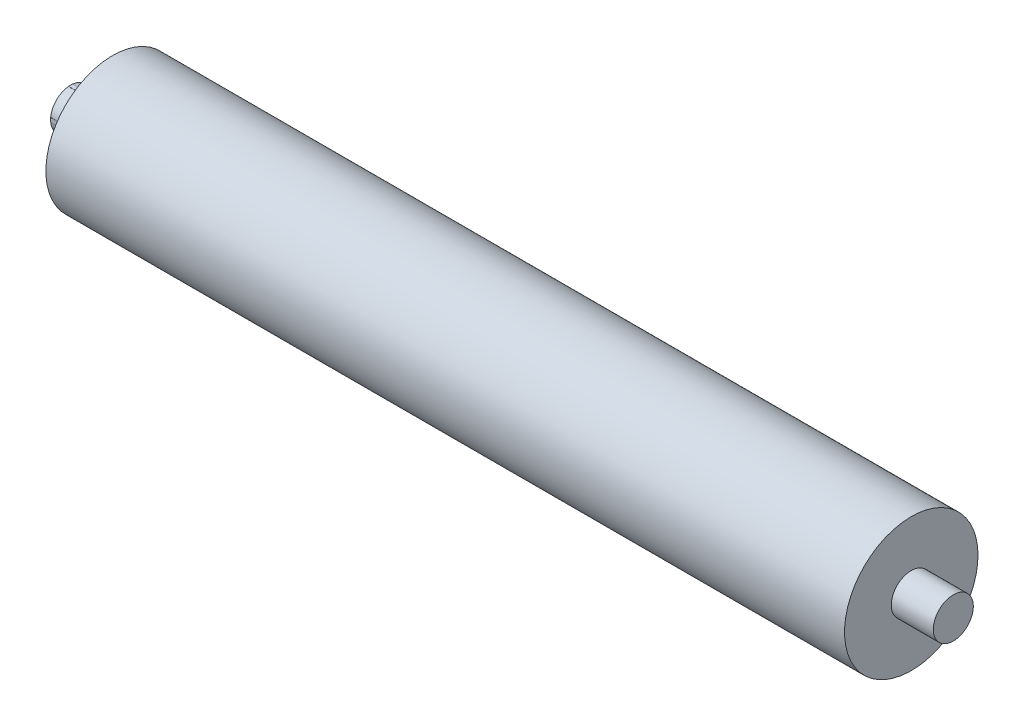
ISO-10303-21;
HEADER;
FILE_DESCRIPTION(('STEP AP214'),'2;1');
FILE_NAME('part.step','',(''),(''),'','','');
FILE_SCHEMA(('AUTOMOTIVE_DESIGN { 1 0 10303 214 1 1 1 1 }'));
ENDSEC;
DATA;
#1=APPLICATION_CONTEXT('core data for automotive mechanical design processes');
#2=APPLICATION_PROTOCOL_DEFINITION('international standard','automotive_design',2000,#1);
#3=PRODUCT_CONTEXT('',#1,'mechanical');
#4=PRODUCT('Part','Part','',(#3));
#5=PRODUCT_RELATED_PRODUCT_CATEGORY('part','',(#4));
#6=PRODUCT_DEFINITION_FORMATION('','',#4);
#7=PRODUCT_DEFINITION_CONTEXT('part definition',#1,'design');
#8=PRODUCT_DEFINITION('design','',#6,#7);
#9=PRODUCT_DEFINITION_SHAPE('','',#8);
#10=(LENGTH_UNIT() NAMED_UNIT(*) SI_UNIT(.MILLI.,.METRE.));
#11=(NAMED_UNIT(*) PLANE_ANGLE_UNIT() SI_UNIT($,.RADIAN.));
#12=(NAMED_UNIT(*) SI_UNIT($,.STERADIAN.) SOLID_ANGLE_UNIT());
#13=UNCERTAINTY_MEASURE_WITH_UNIT(LENGTH_MEASURE(1.E-05),#10,'distance_accuracy_value','');
#14=(GEOMETRIC_REPRESENTATION_CONTEXT(3) GLOBAL_UNCERTAINTY_ASSIGNED_CONTEXT((#13)) GLOBAL_UNIT_ASSIGNED_CONTEXT((#10,
#11,#12)) REPRESENTATION_CONTEXT('',''));
#15=CARTESIAN_POINT('',(0.,0.,0.));
#16=DIRECTION('',(0.,0.,1.));
#17=DIRECTION('',(1.,0.,0.));
#18=AXIS2_PLACEMENT_3D('',#15,#16,#17);
#19=CARTESIAN_POINT('',(20.,0.,0.));
#20=DIRECTION('',(-1.,0.,0.));
#21=DIRECTION('',(0.,0.,1.));
#22=AXIS2_PLACEMENT_3D('',#19,#20,#21);
#23=CYLINDRICAL_SURFACE('',#22,9.525);
#24=CARTESIAN_POINT('',(0.,0.,0.));
#25=DIRECTION('',(1.,0.,0.));
#26=DIRECTION('',(0.,0.,-1.));
#27=AXIS2_PLACEMENT_3D('',#24,#25,#26);
#28=CIRCLE('',#27,9.525);
#29=CARTESIAN_POINT('',(0.,9.47236111009288,1.));
#30=VERTEX_POINT('',#29);
#31=CARTESIAN_POINT('',(0.,1.,9.47236111009288));
#32=VERTEX_POINT('',#31);
#33=EDGE_CURVE('E164',#30,#32,#28,.T.);
#34=ORIENTED_EDGE('',*,*,#33,.T.);
#35=DIRECTION('',(-1.,0.,0.));
#36=VECTOR('',#35,1.);
#37=CARTESIAN_POINT('',(20.,1.,9.47236111009288));
#38=LINE('',#37,#36);
#39=CARTESIAN_POINT('',(20.,1.,9.47236111009288));
#40=VERTEX_POINT('',#39);
#41=EDGE_CURVE('E126',#32,#40,#38,.F.);
#42=ORIENTED_EDGE('',*,*,#41,.T.);
#43=CARTESIAN_POINT('',(20.,0.,0.));
#44=DIRECTION('',(1.,0.,0.));
#45=DIRECTION('',(0.,0.,-1.));
#46=AXIS2_PLACEMENT_3D('',#43,#44,#45);
#47=CIRCLE('',#46,9.525);
#48=CARTESIAN_POINT('',(20.,9.47236111009288,1.));
#49=VERTEX_POINT('',#48);
#50=EDGE_CURVE('E118',#49,#40,#47,.T.);
#51=ORIENTED_EDGE('',*,*,#50,.F.);
#52=DIRECTION('',(-1.,0.,0.));
#53=VECTOR('',#52,1.);
#54=CARTESIAN_POINT('',(20.,9.47236111009288,1.));
#55=LINE('',#54,#53);
#56=EDGE_CURVE('E56',#49,#30,#55,.T.);
#57=ORIENTED_EDGE('',*,*,#56,.T.);
#58=EDGE_LOOP('',(#34,#42,#51,#57));
#59=FACE_BOUND('',#58,.T.);
#60=ADVANCED_FACE('F33',(#59),#23,.T.);
#61=CARTESIAN_POINT('',(20.,-1.,9.47236111009288));
#62=VERTEX_POINT('',#61);
#63=CARTESIAN_POINT('',(20.,9.47236111009288,-1.));
#64=VERTEX_POINT('',#63);
#65=EDGE_CURVE('E163',#62,#64,#47,.T.);
#66=ORIENTED_EDGE('',*,*,#65,.F.);
#67=DIRECTION('',(-1.,0.,0.));
#68=VECTOR('',#67,1.);
#69=CARTESIAN_POINT('',(20.,-1.,9.47236111009288));
#70=LINE('',#69,#68);
#71=CARTESIAN_POINT('',(0.,-1.,9.47236111009288));
#72=VERTEX_POINT('',#71);
#73=EDGE_CURVE('E48',#62,#72,#70,.T.);
#74=ORIENTED_EDGE('',*,*,#73,.T.);
#75=CARTESIAN_POINT('',(0.,9.47236111009288,-1.));
#76=VERTEX_POINT('',#75);
#77=EDGE_CURVE('E158',#72,#76,#28,.T.);
#78=ORIENTED_EDGE('',*,*,#77,.T.);
#79=DIRECTION('',(-1.,0.,0.));
#80=VECTOR('',#79,1.);
#81=CARTESIAN_POINT('',(20.,9.47236111009288,-1.));
#82=LINE('',#81,#80);
#83=EDGE_CURVE('E145',#76,#64,#82,.F.);
#84=ORIENTED_EDGE('',*,*,#83,.T.);
#85=EDGE_LOOP('',(#66,#74,#78,#84));
#86=FACE_BOUND('',#85,.T.);
#87=ADVANCED_FACE('F35',(#86),#23,.T.);
#88=CARTESIAN_POINT('',(0.,0.,0.));
#89=DIRECTION('',(1.,0.,0.));
#90=DIRECTION('',(0.,0.,-1.));
#91=AXIS2_PLACEMENT_3D('',#88,#89,#90);
#92=PLANE('',#91);
#93=DIRECTION('',(0.,0.,1.));
#94=VECTOR('',#93,1.);
#95=CARTESIAN_POINT('',(0.,-1.,8.525));
#96=LINE('',#95,#94);
#97=CARTESIAN_POINT('',(0.,-1.,9.525));
#98=VERTEX_POINT('',#97);
#99=EDGE_CURVE('E188',#72,#98,#96,.T.);
#100=ORIENTED_EDGE('',*,*,#99,.T.);
#101=DIRECTION('',(0.,1.,0.));
#102=VECTOR('',#101,1.);
#103=CARTESIAN_POINT('',(0.,0.,9.525));
#104=LINE('',#103,#102);
#105=CARTESIAN_POINT('',(0.,1.,9.525));
#106=VERTEX_POINT('',#105);
#107=EDGE_CURVE('E122',#98,#106,#104,.T.);
#108=ORIENTED_EDGE('',*,*,#107,.T.);
#109=DIRECTION('',(0.,0.,-1.));
#110=VECTOR('',#109,1.);
#111=CARTESIAN_POINT('',(0.,1.,9.525));
#112=LINE('',#111,#110);
#113=EDGE_CURVE('E112',#106,#32,#112,.T.);
#114=ORIENTED_EDGE('',*,*,#113,.T.);
#115=ORIENTED_EDGE('',*,*,#33,.F.);
#116=DIRECTION('',(0.,1.,0.));
#117=VECTOR('',#116,1.);
#118=CARTESIAN_POINT('',(0.,8.525,1.));
#119=LINE('',#118,#117);
#120=CARTESIAN_POINT('',(0.,9.525,1.));
#121=VERTEX_POINT('',#120);
#122=EDGE_CURVE('E128',#30,#121,#119,.T.);
#123=ORIENTED_EDGE('',*,*,#122,.T.);
#124=DIRECTION('',(0.,0.,-1.));
#125=VECTOR('',#124,1.);
#126=CARTESIAN_POINT('',(0.,9.525,0.));
#127=LINE('',#126,#125);
#128=CARTESIAN_POINT('',(0.,9.525,-1.));
#129=VERTEX_POINT('',#128);
#130=EDGE_CURVE('E130',#121,#129,#127,.T.);
#131=ORIENTED_EDGE('',*,*,#130,.T.);
#132=DIRECTION('',(0.,-1.,0.));
#133=VECTOR('',#132,1.);
#134=CARTESIAN_POINT('',(0.,9.525,-1.));
#135=LINE('',#134,#133);
#136=EDGE_CURVE('E131',#129,#76,#135,.T.);
#137=ORIENTED_EDGE('',*,*,#136,.T.);
#138=ORIENTED_EDGE('',*,*,#77,.F.);
#139=EDGE_LOOP('',(#100,#108,#114,#115,#123,#131,#137,#138));
#140=FACE_BOUND('',#139,.T.);
#141=ADVANCED_FACE('F180',(#140),#92,.F.);
#142=CARTESIAN_POINT('',(400.,0.,0.));
#143=DIRECTION('',(-1.,0.,0.));
#144=DIRECTION('',(0.,0.,1.));
#145=AXIS2_PLACEMENT_3D('',#142,#143,#144);
#146=CYLINDRICAL_SURFACE('',#145,31.75);
#147=CARTESIAN_POINT('',(400.,0.,0.));
#148=DIRECTION('',(1.,0.,0.));
#149=DIRECTION('',(0.,0.,-1.));
#150=AXIS2_PLACEMENT_3D('',#147,#148,#149);
#151=CIRCLE('',#150,31.75);
#152=CARTESIAN_POINT('',(400.,0.,-31.75));
#153=VERTEX_POINT('',#152);
#154=EDGE_CURVE('E155',#153,#153,#151,.T.);
#155=ORIENTED_EDGE('',*,*,#154,.F.);
#156=EDGE_LOOP('',(#155));
#157=FACE_BOUND('',#156,.T.);
#158=CARTESIAN_POINT('',(20.,0.,0.));
#159=DIRECTION('',(1.,0.,0.));
#160=DIRECTION('',(0.,0.,-1.));
#161=AXIS2_PLACEMENT_3D('',#158,#159,#160);
#162=CIRCLE('',#161,31.75);
#163=CARTESIAN_POINT('',(20.,0.,-31.75));
#164=VERTEX_POINT('',#163);
#165=EDGE_CURVE('E152',#164,#164,#162,.T.);
#166=ORIENTED_EDGE('',*,*,#165,.T.);
#167=EDGE_LOOP('',(#166));
#168=FACE_BOUND('',#167,.T.);
#169=ADVANCED_FACE('F206',(#157,#168),#146,.T.);
#170=CARTESIAN_POINT('',(400.,0.,0.));
#171=DIRECTION('',(1.,0.,0.));
#172=DIRECTION('',(0.,0.,-1.));
#173=AXIS2_PLACEMENT_3D('',#170,#171,#172);
#174=PLANE('',#173);
#175=CARTESIAN_POINT('',(400.,0.,0.));
#176=DIRECTION('',(1.,0.,0.));
#177=DIRECTION('',(0.,0.,-1.));
#178=AXIS2_PLACEMENT_3D('',#175,#176,#177);
#179=CIRCLE('',#178,9.525);
#180=CARTESIAN_POINT('',(400.,0.,-9.525));
#181=VERTEX_POINT('',#180);
#182=EDGE_CURVE('E148',#181,#181,#179,.T.);
#183=ORIENTED_EDGE('',*,*,#182,.F.);
#184=EDGE_LOOP('',(#183));
#185=FACE_BOUND('',#184,.T.);
#186=ORIENTED_EDGE('',*,*,#154,.T.);
#187=EDGE_LOOP('',(#186));
#188=FACE_BOUND('',#187,.T.);
#189=ADVANCED_FACE('F211',(#185,#188),#174,.T.);
#190=CARTESIAN_POINT('',(20.,0.,0.));
#191=DIRECTION('',(1.,0.,0.));
#192=DIRECTION('',(0.,0.,-1.));
#193=AXIS2_PLACEMENT_3D('',#190,#191,#192);
#194=PLANE('',#193);
#195=ORIENTED_EDGE('',*,*,#50,.T.);
#196=DIRECTION('',(0.,0.,-1.));
#197=VECTOR('',#196,1.);
#198=CARTESIAN_POINT('',(20.,1.,9.525));
#199=LINE('',#198,#197);
#200=CARTESIAN_POINT('',(20.,1.,9.525));
#201=VERTEX_POINT('',#200);
#202=EDGE_CURVE('E109',#201,#40,#199,.T.);
#203=ORIENTED_EDGE('',*,*,#202,.F.);
#204=DIRECTION('',(0.,-1.,0.));
#205=VECTOR('',#204,1.);
#206=CARTESIAN_POINT('',(20.,0.,9.525));
#207=LINE('',#206,#205);
#208=CARTESIAN_POINT('',(20.,-1.,9.525));
#209=VERTEX_POINT('',#208);
#210=EDGE_CURVE('E11',#201,#209,#207,.T.);
#211=ORIENTED_EDGE('',*,*,#210,.T.);
#212=DIRECTION('',(0.,0.,-1.));
#213=VECTOR('',#212,1.);
#214=CARTESIAN_POINT('',(20.,-1.,0.));
#215=LINE('',#214,#213);
#216=EDGE_CURVE('E41',#209,#62,#215,.T.);
#217=ORIENTED_EDGE('',*,*,#216,.T.);
#218=ORIENTED_EDGE('',*,*,#65,.T.);
#219=DIRECTION('',(0.,-1.,0.));
#220=VECTOR('',#219,1.);
#221=CARTESIAN_POINT('',(20.,9.525,-1.));
#222=LINE('',#221,#220);
#223=CARTESIAN_POINT('',(20.,9.525,-1.));
#224=VERTEX_POINT('',#223);
#225=EDGE_CURVE('E136',#224,#64,#222,.T.);
#226=ORIENTED_EDGE('',*,*,#225,.F.);
#227=DIRECTION('',(0.,0.,1.));
#228=VECTOR('',#227,1.);
#229=CARTESIAN_POINT('',(20.,9.525,0.));
#230=LINE('',#229,#228);
#231=CARTESIAN_POINT('',(20.,9.525,1.));
#232=VERTEX_POINT('',#231);
#233=EDGE_CURVE('E168',#224,#232,#230,.T.);
#234=ORIENTED_EDGE('',*,*,#233,.T.);
#235=DIRECTION('',(0.,-1.,0.));
#236=VECTOR('',#235,1.);
#237=CARTESIAN_POINT('',(20.,0.,1.));
#238=LINE('',#237,#236);
#239=EDGE_CURVE('E162',#232,#49,#238,.T.);
#240=ORIENTED_EDGE('',*,*,#239,.T.);
#241=EDGE_LOOP('',(#195,#203,#211,#217,#218,#226,#234,#240));
#242=FACE_BOUND('',#241,.T.);
#243=ORIENTED_EDGE('',*,*,#165,.F.);
#244=EDGE_LOOP('',(#243));
#245=FACE_BOUND('',#244,.T.);
#246=ADVANCED_FACE('F115',(#242,#245),#194,.F.);
#247=CARTESIAN_POINT('',(420.,0.,0.));
#248=DIRECTION('',(-1.,0.,0.));
#249=DIRECTION('',(0.,0.,1.));
#250=AXIS2_PLACEMENT_3D('',#247,#248,#249);
#251=CYLINDRICAL_SURFACE('',#250,9.525);
#252=CARTESIAN_POINT('',(420.,0.,0.));
#253=DIRECTION('',(1.,0.,0.));
#254=DIRECTION('',(0.,0.,-1.));
#255=AXIS2_PLACEMENT_3D('',#252,#253,#254);
#256=CIRCLE('',#255,9.525);
#257=CARTESIAN_POINT('',(420.,0.,-9.525));
#258=VERTEX_POINT('',#257);
#259=EDGE_CURVE('E149',#258,#258,#256,.T.);
#260=ORIENTED_EDGE('',*,*,#259,.F.);
#261=EDGE_LOOP('',(#260));
#262=FACE_BOUND('',#261,.T.);
#263=ORIENTED_EDGE('',*,*,#182,.T.);
#264=EDGE_LOOP('',(#263));
#265=FACE_BOUND('',#264,.T.);
#266=ADVANCED_FACE('F217',(#262,#265),#251,.T.);
#267=CARTESIAN_POINT('',(420.,0.,0.));
#268=DIRECTION('',(1.,0.,0.));
#269=DIRECTION('',(0.,0.,-1.));
#270=AXIS2_PLACEMENT_3D('',#267,#268,#269);
#271=PLANE('',#270);
#272=ORIENTED_EDGE('',*,*,#259,.T.);
#273=EDGE_LOOP('',(#272));
#274=FACE_BOUND('',#273,.T.);
#275=ADVANCED_FACE('F223',(#274),#271,.T.);
#276=CARTESIAN_POINT('',(22.2360679774998,9.525,0.));
#277=DIRECTION('',(0.,1.,0.));
#278=DIRECTION('',(0.,0.,1.));
#279=AXIS2_PLACEMENT_3D('',#276,#277,#278);
#280=PLANE('',#279);
#281=DIRECTION('',(-1.,0.,0.));
#282=VECTOR('',#281,1.);
#283=CARTESIAN_POINT('',(22.2360679774998,9.525,-1.));
#284=LINE('',#283,#282);
#285=EDGE_CURVE('E134',#224,#129,#284,.T.);
#286=ORIENTED_EDGE('',*,*,#285,.T.);
#287=ORIENTED_EDGE('',*,*,#130,.F.);
#288=DIRECTION('',(-1.,0.,0.));
#289=VECTOR('',#288,1.);
#290=CARTESIAN_POINT('',(22.2360679774998,9.525,1.));
#291=LINE('',#290,#289);
#292=EDGE_CURVE('E139',#232,#121,#291,.T.);
#293=ORIENTED_EDGE('',*,*,#292,.F.);
#294=ORIENTED_EDGE('',*,*,#233,.F.);
#295=EDGE_LOOP('',(#286,#287,#293,#294));
#296=FACE_BOUND('',#295,.T.);
#297=ADVANCED_FACE('F185',(#296),#280,.T.);
#298=CARTESIAN_POINT('',(22.2360679774998,9.525,-1.));
#299=DIRECTION('',(0.,0.,-1.));
#300=DIRECTION('',(0.,1.,0.));
#301=AXIS2_PLACEMENT_3D('',#298,#299,#300);
#302=PLANE('',#301);
#303=ORIENTED_EDGE('',*,*,#83,.F.);
#304=ORIENTED_EDGE('',*,*,#136,.F.);
#305=ORIENTED_EDGE('',*,*,#285,.F.);
#306=ORIENTED_EDGE('',*,*,#225,.T.);
#307=EDGE_LOOP('',(#303,#304,#305,#306));
#308=FACE_BOUND('',#307,.T.);
#309=ADVANCED_FACE('F176',(#308),#302,.T.);
#310=CARTESIAN_POINT('',(22.2360679774998,8.525,1.));
#311=DIRECTION('',(0.,0.,1.));
#312=DIRECTION('',(0.,-1.,0.));
#313=AXIS2_PLACEMENT_3D('',#310,#311,#312);
#314=PLANE('',#313);
#315=ORIENTED_EDGE('',*,*,#56,.F.);
#316=ORIENTED_EDGE('',*,*,#239,.F.);
#317=ORIENTED_EDGE('',*,*,#292,.T.);
#318=ORIENTED_EDGE('',*,*,#122,.F.);
#319=EDGE_LOOP('',(#315,#316,#317,#318));
#320=FACE_BOUND('',#319,.T.);
#321=ADVANCED_FACE('F186',(#320),#314,.T.);
#322=CARTESIAN_POINT('',(22.2360679774998,0.,9.525));
#323=DIRECTION('',(0.,0.,1.));
#324=DIRECTION('',(1.,0.,0.));
#325=AXIS2_PLACEMENT_3D('',#322,#323,#324);
#326=PLANE('',#325);
#327=ORIENTED_EDGE('',*,*,#107,.F.);
#328=DIRECTION('',(-1.,0.,0.));
#329=VECTOR('',#328,1.);
#330=CARTESIAN_POINT('',(22.2360679774998,-1.,9.525));
#331=LINE('',#330,#329);
#332=EDGE_CURVE('E104',#209,#98,#331,.T.);
#333=ORIENTED_EDGE('',*,*,#332,.F.);
#334=ORIENTED_EDGE('',*,*,#210,.F.);
#335=DIRECTION('',(-1.,0.,0.));
#336=VECTOR('',#335,1.);
#337=CARTESIAN_POINT('',(22.2360679774998,1.,9.525));
#338=LINE('',#337,#336);
#339=EDGE_CURVE('E101',#201,#106,#338,.T.);
#340=ORIENTED_EDGE('',*,*,#339,.T.);
#341=EDGE_LOOP('',(#327,#333,#334,#340));
#342=FACE_BOUND('',#341,.T.);
#343=ADVANCED_FACE('F100',(#342),#326,.T.);
#344=CARTESIAN_POINT('',(22.2360679774998,1.,9.525));
#345=DIRECTION('',(0.,1.,0.));
#346=DIRECTION('',(0.,0.,1.));
#347=AXIS2_PLACEMENT_3D('',#344,#345,#346);
#348=PLANE('',#347);
#349=ORIENTED_EDGE('',*,*,#41,.F.);
#350=ORIENTED_EDGE('',*,*,#113,.F.);
#351=ORIENTED_EDGE('',*,*,#339,.F.);
#352=ORIENTED_EDGE('',*,*,#202,.T.);
#353=EDGE_LOOP('',(#349,#350,#351,#352));
#354=FACE_BOUND('',#353,.T.);
#355=ADVANCED_FACE('F108',(#354),#348,.T.);
#356=CARTESIAN_POINT('',(22.2360679774998,-1.,8.525));
#357=DIRECTION('',(0.,-1.,0.));
#358=DIRECTION('',(0.,0.,-1.));
#359=AXIS2_PLACEMENT_3D('',#356,#357,#358);
#360=PLANE('',#359);
#361=ORIENTED_EDGE('',*,*,#73,.F.);
#362=ORIENTED_EDGE('',*,*,#216,.F.);
#363=ORIENTED_EDGE('',*,*,#332,.T.);
#364=ORIENTED_EDGE('',*,*,#99,.F.);
#365=EDGE_LOOP('',(#361,#362,#363,#364));
#366=FACE_BOUND('',#365,.T.);
#367=ADVANCED_FACE('F190',(#366),#360,.T.);
#368=CLOSED_SHELL('',(#60,#87,#141,#169,#189,#246,#266,#275,#297,#309,#321,#343,#355,#367));
#369=MANIFOLD_SOLID_BREP('B2',#368);
#370=ADVANCED_BREP_SHAPE_REPRESENTATION('',(#18,#369),#14);
#371=SHAPE_DEFINITION_REPRESENTATION(#9,#370);
ENDSEC;
END-ISO-10303-21;
